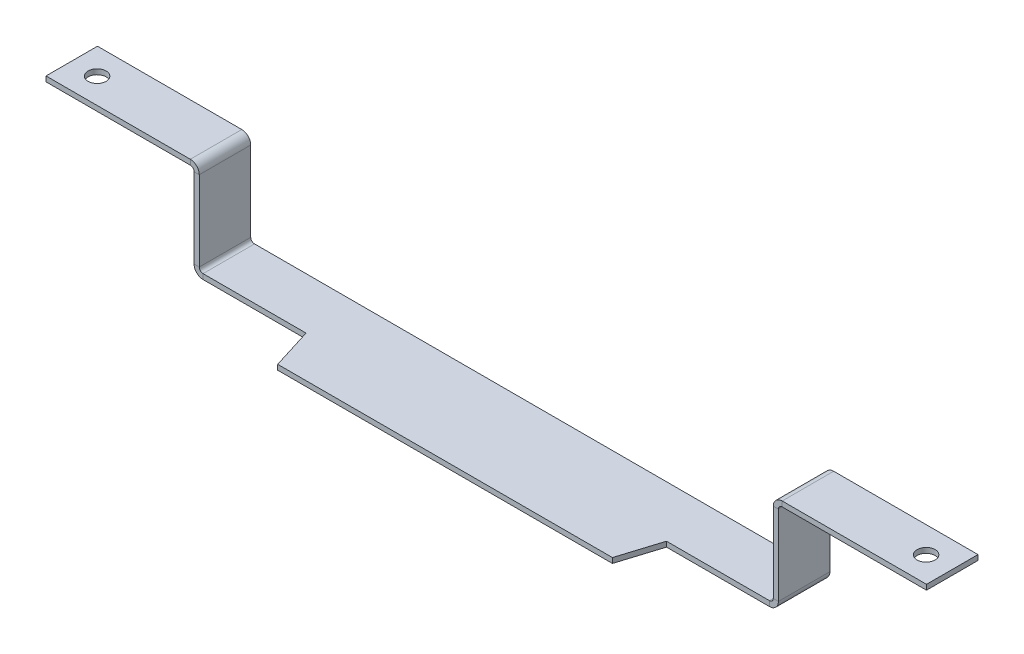
ISO-10303-21;
HEADER;
FILE_DESCRIPTION(('STEP AP214'),'2;1');
FILE_NAME('part.step','',(''),(''),'','','');
FILE_SCHEMA(('AUTOMOTIVE_DESIGN { 1 0 10303 214 1 1 1 1 }'));
ENDSEC;
DATA;
#1=APPLICATION_CONTEXT('core data for automotive mechanical design processes');
#2=APPLICATION_PROTOCOL_DEFINITION('international standard','automotive_design',2000,#1);
#3=PRODUCT_CONTEXT('',#1,'mechanical');
#4=PRODUCT('Part','Part','',(#3));
#5=PRODUCT_RELATED_PRODUCT_CATEGORY('part','',(#4));
#6=PRODUCT_DEFINITION_FORMATION('','',#4);
#7=PRODUCT_DEFINITION_CONTEXT('part definition',#1,'design');
#8=PRODUCT_DEFINITION('design','',#6,#7);
#9=PRODUCT_DEFINITION_SHAPE('','',#8);
#10=(LENGTH_UNIT() NAMED_UNIT(*) SI_UNIT(.MILLI.,.METRE.));
#11=(NAMED_UNIT(*) PLANE_ANGLE_UNIT() SI_UNIT($,.RADIAN.));
#12=(NAMED_UNIT(*) SI_UNIT($,.STERADIAN.) SOLID_ANGLE_UNIT());
#13=UNCERTAINTY_MEASURE_WITH_UNIT(LENGTH_MEASURE(1.E-05),#10,'distance_accuracy_value','');
#14=(GEOMETRIC_REPRESENTATION_CONTEXT(3) GLOBAL_UNCERTAINTY_ASSIGNED_CONTEXT((#13)) GLOBAL_UNIT_ASSIGNED_CONTEXT((#10,
#11,#12)) REPRESENTATION_CONTEXT('',''));
#15=CARTESIAN_POINT('',(0.,0.,0.));
#16=DIRECTION('',(0.,0.,1.));
#17=DIRECTION('',(1.,0.,0.));
#18=AXIS2_PLACEMENT_3D('',#15,#16,#17);
#19=CARTESIAN_POINT('',(0.,0.,0.));
#20=DIRECTION('',(0.,1.,0.));
#21=DIRECTION('',(0.,0.,1.));
#22=AXIS2_PLACEMENT_3D('',#19,#20,#21);
#23=PLANE('',#22);
#24=DIRECTION('',(1.,0.,0.));
#25=VECTOR('',#24,1.);
#26=CARTESIAN_POINT('',(0.,0.,5.));
#27=LINE('',#26,#25);
#28=CARTESIAN_POINT('',(-55.,0.,5.));
#29=VERTEX_POINT('',#28);
#30=CARTESIAN_POINT('',(-35.,0.,5.));
#31=VERTEX_POINT('',#30);
#32=EDGE_CURVE('E383',#29,#31,#27,.T.);
#33=ORIENTED_EDGE('',*,*,#32,.F.);
#34=DIRECTION('',(0.,0.,-1.));
#35=VECTOR('',#34,1.);
#36=CARTESIAN_POINT('',(-55.,0.,0.));
#37=LINE('',#36,#35);
#38=CARTESIAN_POINT('',(-55.,0.,-5.));
#39=VERTEX_POINT('',#38);
#40=EDGE_CURVE('E439',#29,#39,#37,.T.);
#41=ORIENTED_EDGE('',*,*,#40,.T.);
#42=DIRECTION('',(1.,0.,0.));
#43=VECTOR('',#42,1.);
#44=CARTESIAN_POINT('',(0.,0.,-5.));
#45=LINE('',#44,#43);
#46=CARTESIAN_POINT('',(55.,0.,-5.));
#47=VERTEX_POINT('',#46);
#48=EDGE_CURVE('E363',#39,#47,#45,.T.);
#49=ORIENTED_EDGE('',*,*,#48,.T.);
#50=DIRECTION('',(0.,0.,-1.));
#51=VECTOR('',#50,1.);
#52=CARTESIAN_POINT('',(55.,0.,0.));
#53=LINE('',#52,#51);
#54=CARTESIAN_POINT('',(55.,0.,5.));
#55=VERTEX_POINT('',#54);
#56=EDGE_CURVE('E397',#55,#47,#53,.T.);
#57=ORIENTED_EDGE('',*,*,#56,.F.);
#58=CARTESIAN_POINT('',(35.,0.,5.));
#59=VERTEX_POINT('',#58);
#60=EDGE_CURVE('E362',#59,#55,#27,.T.);
#61=ORIENTED_EDGE('',*,*,#60,.F.);
#62=DIRECTION('',(-0.298274993135952,0.,0.954479978035028));
#63=VECTOR('',#62,1.);
#64=CARTESIAN_POINT('',(33.3096085409252,0.,10.4092526690393));
#65=LINE('',#64,#63);
#66=CARTESIAN_POINT('',(32.5,0.,13.));
#67=VERTEX_POINT('',#66);
#68=EDGE_CURVE('E364',#59,#67,#65,.T.);
#69=ORIENTED_EDGE('',*,*,#68,.T.);
#70=DIRECTION('',(1.,0.,0.));
#71=VECTOR('',#70,1.);
#72=CARTESIAN_POINT('',(0.,0.,13.));
#73=LINE('',#72,#71);
#74=CARTESIAN_POINT('',(-32.5,0.,13.));
#75=VERTEX_POINT('',#74);
#76=EDGE_CURVE('E389',#75,#67,#73,.T.);
#77=ORIENTED_EDGE('',*,*,#76,.F.);
#78=DIRECTION('',(0.298274993135952,0.,0.954479978035028));
#79=VECTOR('',#78,1.);
#80=CARTESIAN_POINT('',(-33.3096085409252,0.,10.4092526690393));
#81=LINE('',#80,#79);
#82=EDGE_CURVE('E384',#31,#75,#81,.T.);
#83=ORIENTED_EDGE('',*,*,#82,.F.);
#84=EDGE_LOOP('',(#33,#41,#49,#57,#61,#69,#77,#83));
#85=FACE_BOUND('',#84,.T.);
#86=ADVANCED_FACE('F51',(#85),#23,.F.);
#87=CARTESIAN_POINT('',(0.,1.,5.));
#88=DIRECTION('',(0.,0.,-1.));
#89=DIRECTION('',(-1.,0.,0.));
#90=AXIS2_PLACEMENT_3D('',#87,#88,#89);
#91=PLANE('',#90);
#92=DIRECTION('',(1.,0.,0.));
#93=VECTOR('',#92,1.);
#94=CARTESIAN_POINT('',(0.,1.,5.));
#95=LINE('',#94,#93);
#96=CARTESIAN_POINT('',(-55.,1.,5.));
#97=VERTEX_POINT('',#96);
#98=CARTESIAN_POINT('',(-35.,1.,5.));
#99=VERTEX_POINT('',#98);
#100=EDGE_CURVE('E375',#97,#99,#95,.T.);
#101=ORIENTED_EDGE('',*,*,#100,.F.);
#102=DIRECTION('',(0.,-1.,0.));
#103=VECTOR('',#102,1.);
#104=CARTESIAN_POINT('',(-55.,1.,5.));
#105=LINE('',#104,#103);
#106=EDGE_CURVE('E442',#97,#29,#105,.T.);
#107=ORIENTED_EDGE('',*,*,#106,.T.);
#108=ORIENTED_EDGE('',*,*,#32,.T.);
#109=DIRECTION('',(0.,-1.,0.));
#110=VECTOR('',#109,1.);
#111=CARTESIAN_POINT('',(-35.,1.,5.));
#112=LINE('',#111,#110);
#113=EDGE_CURVE('E380',#99,#31,#112,.T.);
#114=ORIENTED_EDGE('',*,*,#113,.F.);
#115=EDGE_LOOP('',(#101,#107,#108,#114));
#116=FACE_BOUND('',#115,.T.);
#117=ADVANCED_FACE('F485',(#116),#91,.F.);
#118=CARTESIAN_POINT('',(55.7366000000002,-55.2058467377146,0.));
#119=DIRECTION('',(-1.,0.,0.));
#120=DIRECTION('',(0.,0.,1.));
#121=AXIS2_PLACEMENT_3D('',#118,#119,#120);
#122=PLANE('',#121);
#123=DIRECTION('',(0.,1.,0.));
#124=VECTOR('',#123,1.);
#125=CARTESIAN_POINT('',(55.7366000000002,-55.2058467377146,4.99999999999992));
#126=LINE('',#125,#124);
#127=CARTESIAN_POINT('',(55.7366,1.73659999999999,5.));
#128=VERTEX_POINT('',#127);
#129=CARTESIAN_POINT('',(55.7366,17.2634,5.00000000000002));
#130=VERTEX_POINT('',#129);
#131=EDGE_CURVE('E431',#128,#130,#126,.T.);
#132=ORIENTED_EDGE('',*,*,#131,.T.);
#133=DIRECTION('',(0.,0.,-1.));
#134=VECTOR('',#133,1.);
#135=CARTESIAN_POINT('',(55.7366,17.2634,0.));
#136=LINE('',#135,#134);
#137=CARTESIAN_POINT('',(55.7365999999999,17.2634,-4.99999999999998));
#138=VERTEX_POINT('',#137);
#139=EDGE_CURVE('E414',#130,#138,#136,.T.);
#140=ORIENTED_EDGE('',*,*,#139,.T.);
#141=DIRECTION('',(0.,1.,0.));
#142=VECTOR('',#141,1.);
#143=CARTESIAN_POINT('',(55.7366000000002,-55.2058467377146,-5.00000000000008));
#144=LINE('',#143,#142);
#145=CARTESIAN_POINT('',(55.7366,1.7366,-5.));
#146=VERTEX_POINT('',#145);
#147=EDGE_CURVE('E425',#146,#138,#144,.T.);
#148=ORIENTED_EDGE('',*,*,#147,.F.);
#149=DIRECTION('',(0.,0.,-1.));
#150=VECTOR('',#149,1.);
#151=CARTESIAN_POINT('',(55.7366,1.7366,0.));
#152=LINE('',#151,#150);
#153=EDGE_CURVE('E401',#128,#146,#152,.T.);
#154=ORIENTED_EDGE('',*,*,#153,.F.);
#155=EDGE_LOOP('',(#132,#140,#148,#154));
#156=FACE_BOUND('',#155,.T.);
#157=ADVANCED_FACE('F564',(#156),#122,.T.);
#158=CARTESIAN_POINT('',(55.7366000000002,-55.2058467377146,-5.00000000000008));
#159=DIRECTION('',(0.,0.,-1.));
#160=DIRECTION('',(0.,-1.,0.));
#161=AXIS2_PLACEMENT_3D('',#158,#159,#160);
#162=PLANE('',#161);
#163=ORIENTED_EDGE('',*,*,#147,.T.);
#164=DIRECTION('',(1.,0.,0.));
#165=VECTOR('',#164,1.);
#166=CARTESIAN_POINT('',(55.7365999999999,17.2634,-4.99999999999998));
#167=LINE('',#166,#165);
#168=CARTESIAN_POINT('',(56.7366,17.2634,-4.99999999999998));
#169=VERTEX_POINT('',#168);
#170=EDGE_CURVE('E421',#138,#169,#167,.T.);
#171=ORIENTED_EDGE('',*,*,#170,.T.);
#172=DIRECTION('',(0.,1.,0.));
#173=VECTOR('',#172,1.);
#174=CARTESIAN_POINT('',(56.7366000000002,-55.2058467377146,-5.00000000000008));
#175=LINE('',#174,#173);
#176=CARTESIAN_POINT('',(56.7366,1.7366,-5.));
#177=VERTEX_POINT('',#176);
#178=EDGE_CURVE('E405',#177,#169,#175,.T.);
#179=ORIENTED_EDGE('',*,*,#178,.F.);
#180=DIRECTION('',(1.,0.,0.));
#181=VECTOR('',#180,1.);
#182=CARTESIAN_POINT('',(55.7366,1.7366,-5.));
#183=LINE('',#182,#181);
#184=EDGE_CURVE('E404',#146,#177,#183,.T.);
#185=ORIENTED_EDGE('',*,*,#184,.F.);
#186=EDGE_LOOP('',(#163,#171,#179,#185));
#187=FACE_BOUND('',#186,.T.);
#188=ADVANCED_FACE('F659',(#187),#162,.T.);
#189=CARTESIAN_POINT('',(55.7366000000002,-55.2058467377146,4.99999999999992));
#190=DIRECTION('',(0.,0.,-1.));
#191=DIRECTION('',(0.,-1.,0.));
#192=AXIS2_PLACEMENT_3D('',#189,#190,#191);
#193=PLANE('',#192);
#194=DIRECTION('',(1.,0.,0.));
#195=VECTOR('',#194,1.);
#196=CARTESIAN_POINT('',(55.7366,17.2634,5.00000000000002));
#197=LINE('',#196,#195);
#198=CARTESIAN_POINT('',(56.7366,17.2634,5.00000000000002));
#199=VERTEX_POINT('',#198);
#200=EDGE_CURVE('E417',#130,#199,#197,.T.);
#201=ORIENTED_EDGE('',*,*,#200,.F.);
#202=ORIENTED_EDGE('',*,*,#131,.F.);
#203=DIRECTION('',(1.,0.,0.));
#204=VECTOR('',#203,1.);
#205=CARTESIAN_POINT('',(55.7366,1.7366,5.));
#206=LINE('',#205,#204);
#207=CARTESIAN_POINT('',(56.7366,1.7366,5.));
#208=VERTEX_POINT('',#207);
#209=EDGE_CURVE('E411',#128,#208,#206,.T.);
#210=ORIENTED_EDGE('',*,*,#209,.T.);
#211=DIRECTION('',(0.,1.,0.));
#212=VECTOR('',#211,1.);
#213=CARTESIAN_POINT('',(56.7366000000002,-55.2058467377146,4.99999999999992));
#214=LINE('',#213,#212);
#215=EDGE_CURVE('E428',#208,#199,#214,.T.);
#216=ORIENTED_EDGE('',*,*,#215,.T.);
#217=EDGE_LOOP('',(#201,#202,#210,#216));
#218=FACE_BOUND('',#217,.T.);
#219=ADVANCED_FACE('F661',(#218),#193,.F.);
#220=CARTESIAN_POINT('',(56.7366000000002,-55.2058467377146,0.));
#221=DIRECTION('',(-1.,0.,0.));
#222=DIRECTION('',(0.,0.,1.));
#223=AXIS2_PLACEMENT_3D('',#220,#221,#222);
#224=PLANE('',#223);
#225=DIRECTION('',(0.,0.,-1.));
#226=VECTOR('',#225,1.);
#227=CARTESIAN_POINT('',(56.7366,17.2634,0.));
#228=LINE('',#227,#226);
#229=EDGE_CURVE('E419',#199,#169,#228,.T.);
#230=ORIENTED_EDGE('',*,*,#229,.F.);
#231=ORIENTED_EDGE('',*,*,#215,.F.);
#232=DIRECTION('',(0.,0.,-1.));
#233=VECTOR('',#232,1.);
#234=CARTESIAN_POINT('',(56.7366,1.7366,0.));
#235=LINE('',#234,#233);
#236=EDGE_CURVE('E408',#208,#177,#235,.T.);
#237=ORIENTED_EDGE('',*,*,#236,.T.);
#238=ORIENTED_EDGE('',*,*,#178,.T.);
#239=EDGE_LOOP('',(#230,#231,#237,#238));
#240=FACE_BOUND('',#239,.T.);
#241=ADVANCED_FACE('F652',(#240),#224,.F.);
#242=CARTESIAN_POINT('',(33.3096085409252,1.,10.4092526690393));
#243=DIRECTION('',(0.954479978035028,0.,0.298274993135952));
#244=DIRECTION('',(0.298274993135952,0.,-0.954479978035028));
#245=AXIS2_PLACEMENT_3D('',#242,#243,#244);
#246=PLANE('',#245);
#247=ORIENTED_EDGE('',*,*,#68,.F.);
#248=DIRECTION('',(0.,-1.,0.));
#249=VECTOR('',#248,1.);
#250=CARTESIAN_POINT('',(35.,1.,5.));
#251=LINE('',#250,#249);
#252=CARTESIAN_POINT('',(35.,1.,5.));
#253=VERTEX_POINT('',#252);
#254=EDGE_CURVE('E360',#253,#59,#251,.T.);
#255=ORIENTED_EDGE('',*,*,#254,.F.);
#256=DIRECTION('',(-0.298274993135952,0.,0.954479978035028));
#257=VECTOR('',#256,1.);
#258=CARTESIAN_POINT('',(33.3096085409252,1.,10.4092526690393));
#259=LINE('',#258,#257);
#260=CARTESIAN_POINT('',(32.5,1.,13.));
#261=VERTEX_POINT('',#260);
#262=EDGE_CURVE('E394',#253,#261,#259,.T.);
#263=ORIENTED_EDGE('',*,*,#262,.T.);
#264=DIRECTION('',(0.,-1.,0.));
#265=VECTOR('',#264,1.);
#266=CARTESIAN_POINT('',(32.5,1.,13.));
#267=LINE('',#266,#265);
#268=EDGE_CURVE('E392',#261,#67,#267,.T.);
#269=ORIENTED_EDGE('',*,*,#268,.T.);
#270=EDGE_LOOP('',(#247,#255,#263,#269));
#271=FACE_BOUND('',#270,.T.);
#272=ADVANCED_FACE('F500',(#271),#246,.T.);
#273=CARTESIAN_POINT('',(0.,1.,13.));
#274=DIRECTION('',(0.,0.,-1.));
#275=DIRECTION('',(-1.,0.,0.));
#276=AXIS2_PLACEMENT_3D('',#273,#274,#275);
#277=PLANE('',#276);
#278=ORIENTED_EDGE('',*,*,#76,.T.);
#279=ORIENTED_EDGE('',*,*,#268,.F.);
#280=DIRECTION('',(1.,0.,0.));
#281=VECTOR('',#280,1.);
#282=CARTESIAN_POINT('',(0.,1.,13.));
#283=LINE('',#282,#281);
#284=CARTESIAN_POINT('',(-32.5,1.,13.));
#285=VERTEX_POINT('',#284);
#286=EDGE_CURVE('E371',#285,#261,#283,.T.);
#287=ORIENTED_EDGE('',*,*,#286,.F.);
#288=DIRECTION('',(0.,-1.,0.));
#289=VECTOR('',#288,1.);
#290=CARTESIAN_POINT('',(-32.5,1.,13.));
#291=LINE('',#290,#289);
#292=EDGE_CURVE('E386',#285,#75,#291,.T.);
#293=ORIENTED_EDGE('',*,*,#292,.T.);
#294=EDGE_LOOP('',(#278,#279,#287,#293));
#295=FACE_BOUND('',#294,.T.);
#296=ADVANCED_FACE('F496',(#295),#277,.F.);
#297=CARTESIAN_POINT('',(-33.3096085409252,1.,10.4092526690393));
#298=DIRECTION('',(0.954479978035028,0.,-0.298274993135952));
#299=DIRECTION('',(-0.298274993135952,0.,-0.954479978035028));
#300=AXIS2_PLACEMENT_3D('',#297,#298,#299);
#301=PLANE('',#300);
#302=ORIENTED_EDGE('',*,*,#82,.T.);
#303=ORIENTED_EDGE('',*,*,#292,.F.);
#304=DIRECTION('',(0.298274993135952,0.,0.954479978035028));
#305=VECTOR('',#304,1.);
#306=CARTESIAN_POINT('',(-33.3096085409252,1.,10.4092526690393));
#307=LINE('',#306,#305);
#308=EDGE_CURVE('E373',#99,#285,#307,.T.);
#309=ORIENTED_EDGE('',*,*,#308,.F.);
#310=ORIENTED_EDGE('',*,*,#113,.T.);
#311=EDGE_LOOP('',(#302,#303,#309,#310));
#312=FACE_BOUND('',#311,.T.);
#313=ADVANCED_FACE('F491',(#312),#301,.F.);
#314=CARTESIAN_POINT('',(0.,1.,0.));
#315=DIRECTION('',(0.,1.,0.));
#316=DIRECTION('',(0.,0.,1.));
#317=AXIS2_PLACEMENT_3D('',#314,#315,#316);
#318=PLANE('',#317);
#319=DIRECTION('',(0.,0.,-1.));
#320=VECTOR('',#319,1.);
#321=CARTESIAN_POINT('',(-55.,1.,0.));
#322=LINE('',#321,#320);
#323=CARTESIAN_POINT('',(-55.,1.,-5.));
#324=VERTEX_POINT('',#323);
#325=EDGE_CURVE('E424',#97,#324,#322,.T.);
#326=ORIENTED_EDGE('',*,*,#325,.F.);
#327=ORIENTED_EDGE('',*,*,#100,.T.);
#328=ORIENTED_EDGE('',*,*,#308,.T.);
#329=ORIENTED_EDGE('',*,*,#286,.T.);
#330=ORIENTED_EDGE('',*,*,#262,.F.);
#331=CARTESIAN_POINT('',(55.,1.,5.));
#332=VERTEX_POINT('',#331);
#333=EDGE_CURVE('E379',#253,#332,#95,.T.);
#334=ORIENTED_EDGE('',*,*,#333,.T.);
#335=DIRECTION('',(0.,0.,-1.));
#336=VECTOR('',#335,1.);
#337=CARTESIAN_POINT('',(55.,1.,0.));
#338=LINE('',#337,#336);
#339=CARTESIAN_POINT('',(55.,1.,-5.));
#340=VERTEX_POINT('',#339);
#341=EDGE_CURVE('E376',#332,#340,#338,.T.);
#342=ORIENTED_EDGE('',*,*,#341,.T.);
#343=DIRECTION('',(1.,0.,0.));
#344=VECTOR('',#343,1.);
#345=CARTESIAN_POINT('',(0.,1.,-5.));
#346=LINE('',#345,#344);
#347=EDGE_CURVE('E370',#324,#340,#346,.T.);
#348=ORIENTED_EDGE('',*,*,#347,.F.);
#349=EDGE_LOOP('',(#326,#327,#328,#329,#330,#334,#342,#348));
#350=FACE_BOUND('',#349,.T.);
#351=ADVANCED_FACE('F481',(#350),#318,.T.);
#352=CARTESIAN_POINT('',(0.,1.,-5.));
#353=DIRECTION('',(0.,0.,-1.));
#354=DIRECTION('',(-1.,0.,0.));
#355=AXIS2_PLACEMENT_3D('',#352,#353,#354);
#356=PLANE('',#355);
#357=DIRECTION('',(0.,-1.,0.));
#358=VECTOR('',#357,1.);
#359=CARTESIAN_POINT('',(-55.,1.,-5.));
#360=LINE('',#359,#358);
#361=EDGE_CURVE('E437',#324,#39,#360,.T.);
#362=ORIENTED_EDGE('',*,*,#361,.F.);
#363=ORIENTED_EDGE('',*,*,#347,.T.);
#364=DIRECTION('',(0.,-1.,0.));
#365=VECTOR('',#364,1.);
#366=CARTESIAN_POINT('',(55.,1.,-5.));
#367=LINE('',#366,#365);
#368=EDGE_CURVE('E367',#340,#47,#367,.T.);
#369=ORIENTED_EDGE('',*,*,#368,.T.);
#370=ORIENTED_EDGE('',*,*,#48,.F.);
#371=EDGE_LOOP('',(#362,#363,#369,#370));
#372=FACE_BOUND('',#371,.T.);
#373=ADVANCED_FACE('F516',(#372),#356,.T.);
#374=DIRECTION('',(0.,-1.,0.));
#375=VECTOR('',#374,1.);
#376=CARTESIAN_POINT('',(55.,1.,5.));
#377=LINE('',#376,#375);
#378=EDGE_CURVE('E355',#332,#55,#377,.T.);
#379=ORIENTED_EDGE('',*,*,#378,.F.);
#380=ORIENTED_EDGE('',*,*,#333,.F.);
#381=ORIENTED_EDGE('',*,*,#254,.T.);
#382=ORIENTED_EDGE('',*,*,#60,.T.);
#383=EDGE_LOOP('',(#379,#380,#381,#382));
#384=FACE_BOUND('',#383,.T.);
#385=ADVANCED_FACE('F505',(#384),#91,.F.);
#386=CARTESIAN_POINT('',(55.,1.7366,5.));
#387=DIRECTION('',(0.,0.,-1.));
#388=DIRECTION('',(-1.,0.,0.));
#389=AXIS2_PLACEMENT_3D('',#386,#387,#388);
#390=PLANE('',#389);
#391=ORIENTED_EDGE('',*,*,#378,.T.);
#392=CARTESIAN_POINT('',(55.,1.7366,5.));
#393=DIRECTION('',(0.,0.,-1.));
#394=DIRECTION('',(-1.,0.,0.));
#395=AXIS2_PLACEMENT_3D('',#392,#393,#394);
#396=CIRCLE('',#395,1.7366);
#397=EDGE_CURVE('E343',#55,#208,#396,.F.);
#398=ORIENTED_EDGE('',*,*,#397,.T.);
#399=ORIENTED_EDGE('',*,*,#209,.F.);
#400=CARTESIAN_POINT('',(55.,1.7366,5.));
#401=DIRECTION('',(0.,0.,1.));
#402=DIRECTION('',(1.,0.,0.));
#403=AXIS2_PLACEMENT_3D('',#400,#401,#402);
#404=CIRCLE('',#403,0.736599999999998);
#405=EDGE_CURVE('E348',#332,#128,#404,.T.);
#406=ORIENTED_EDGE('',*,*,#405,.F.);
#407=EDGE_LOOP('',(#391,#398,#399,#406));
#408=FACE_BOUND('',#407,.T.);
#409=ADVANCED_FACE('F646',(#408),#390,.F.);
#410=CARTESIAN_POINT('',(55.,1.7366,-5.));
#411=DIRECTION('',(0.,0.,1.));
#412=DIRECTION('',(1.,0.,0.));
#413=AXIS2_PLACEMENT_3D('',#410,#411,#412);
#414=PLANE('',#413);
#415=ORIENTED_EDGE('',*,*,#184,.T.);
#416=CARTESIAN_POINT('',(55.,1.7366,-5.));
#417=DIRECTION('',(0.,0.,-1.));
#418=DIRECTION('',(-1.,0.,0.));
#419=AXIS2_PLACEMENT_3D('',#416,#417,#418);
#420=CIRCLE('',#419,1.7366);
#421=EDGE_CURVE('E352',#177,#47,#420,.T.);
#422=ORIENTED_EDGE('',*,*,#421,.T.);
#423=ORIENTED_EDGE('',*,*,#368,.F.);
#424=CARTESIAN_POINT('',(55.,1.7366,-5.));
#425=DIRECTION('',(0.,0.,-1.));
#426=DIRECTION('',(1.,0.,0.));
#427=AXIS2_PLACEMENT_3D('',#424,#425,#426);
#428=CIRCLE('',#427,0.736599999999998);
#429=EDGE_CURVE('E351',#146,#340,#428,.T.);
#430=ORIENTED_EDGE('',*,*,#429,.F.);
#431=EDGE_LOOP('',(#415,#422,#423,#430));
#432=FACE_BOUND('',#431,.T.);
#433=ADVANCED_FACE('F512',(#432),#414,.F.);
#434=CARTESIAN_POINT('',(55.,1.7366,10.2358731590841));
#435=DIRECTION('',(0.,0.,-1.));
#436=DIRECTION('',(-1.,0.,0.));
#437=AXIS2_PLACEMENT_3D('',#434,#435,#436);
#438=CYLINDRICAL_SURFACE('',#437,0.7366);
#439=ORIENTED_EDGE('',*,*,#429,.T.);
#440=ORIENTED_EDGE('',*,*,#341,.F.);
#441=ORIENTED_EDGE('',*,*,#405,.T.);
#442=ORIENTED_EDGE('',*,*,#153,.T.);
#443=EDGE_LOOP('',(#439,#440,#441,#442));
#444=FACE_BOUND('',#443,.T.);
#445=ADVANCED_FACE('F508',(#444),#438,.F.);
#446=CARTESIAN_POINT('',(55.,1.7366,10.2358731590841));
#447=DIRECTION('',(0.,0.,-1.));
#448=DIRECTION('',(-1.,0.,0.));
#449=AXIS2_PLACEMENT_3D('',#446,#447,#448);
#450=CYLINDRICAL_SURFACE('',#449,1.7366);
#451=ORIENTED_EDGE('',*,*,#421,.F.);
#452=ORIENTED_EDGE('',*,*,#236,.F.);
#453=ORIENTED_EDGE('',*,*,#397,.F.);
#454=ORIENTED_EDGE('',*,*,#56,.T.);
#455=EDGE_LOOP('',(#451,#452,#453,#454));
#456=FACE_BOUND('',#455,.T.);
#457=ADVANCED_FACE('F637',(#456),#450,.T.);
#458=CARTESIAN_POINT('',(57.4732,17.2634,5.00000000000002));
#459=DIRECTION('',(0.,0.,1.));
#460=DIRECTION('',(0.,-1.,0.));
#461=AXIS2_PLACEMENT_3D('',#458,#459,#460);
#462=PLANE('',#461);
#463=ORIENTED_EDGE('',*,*,#200,.T.);
#464=CARTESIAN_POINT('',(57.4732,17.2634,5.00000000000002));
#465=DIRECTION('',(0.,0.,-1.));
#466=DIRECTION('',(-1.,0.,0.));
#467=AXIS2_PLACEMENT_3D('',#464,#465,#466);
#468=CIRCLE('',#467,0.7366);
#469=CARTESIAN_POINT('',(57.4732,18.,5.00000000000002));
#470=VERTEX_POINT('',#469);
#471=EDGE_CURVE('E301',#199,#470,#468,.T.);
#472=ORIENTED_EDGE('',*,*,#471,.T.);
#473=DIRECTION('',(0.,-1.,0.));
#474=VECTOR('',#473,1.);
#475=CARTESIAN_POINT('',(57.4732,19.,5.00000000000002));
#476=LINE('',#475,#474);
#477=CARTESIAN_POINT('',(57.4732,19.,5.00000000000002));
#478=VERTEX_POINT('',#477);
#479=EDGE_CURVE('E317',#478,#470,#476,.T.);
#480=ORIENTED_EDGE('',*,*,#479,.F.);
#481=CARTESIAN_POINT('',(57.4732,17.2634,5.00000000000002));
#482=DIRECTION('',(0.,0.,-1.));
#483=DIRECTION('',(0.,1.,0.));
#484=AXIS2_PLACEMENT_3D('',#481,#482,#483);
#485=CIRCLE('',#484,1.7366);
#486=EDGE_CURVE('E336',#130,#478,#485,.T.);
#487=ORIENTED_EDGE('',*,*,#486,.F.);
#488=EDGE_LOOP('',(#463,#472,#480,#487));
#489=FACE_BOUND('',#488,.T.);
#490=ADVANCED_FACE('F633',(#489),#462,.T.);
#491=CARTESIAN_POINT('',(57.4731999999999,17.2634,-4.99999999999998));
#492=DIRECTION('',(0.,0.,-1.));
#493=DIRECTION('',(0.,1.,0.));
#494=AXIS2_PLACEMENT_3D('',#491,#492,#493);
#495=PLANE('',#494);
#496=DIRECTION('',(0.,-1.,0.));
#497=VECTOR('',#496,1.);
#498=CARTESIAN_POINT('',(57.4731999999999,19.,-4.99999999999998));
#499=LINE('',#498,#497);
#500=CARTESIAN_POINT('',(57.4731999999999,19.,-4.99999999999998));
#501=VERTEX_POINT('',#500);
#502=CARTESIAN_POINT('',(57.4731999999999,18.,-4.99999999999998));
#503=VERTEX_POINT('',#502);
#504=EDGE_CURVE('E331',#501,#503,#499,.T.);
#505=ORIENTED_EDGE('',*,*,#504,.T.);
#506=CARTESIAN_POINT('',(57.4731999999999,17.2634,-4.99999999999998));
#507=DIRECTION('',(0.,0.,-1.));
#508=DIRECTION('',(-1.,0.,0.));
#509=AXIS2_PLACEMENT_3D('',#506,#507,#508);
#510=CIRCLE('',#509,0.7366);
#511=EDGE_CURVE('E340',#503,#169,#510,.F.);
#512=ORIENTED_EDGE('',*,*,#511,.T.);
#513=ORIENTED_EDGE('',*,*,#170,.F.);
#514=CARTESIAN_POINT('',(57.4731999999999,17.2634,-4.99999999999998));
#515=DIRECTION('',(0.,0.,1.));
#516=DIRECTION('',(0.,1.,0.));
#517=AXIS2_PLACEMENT_3D('',#514,#515,#516);
#518=CIRCLE('',#517,1.7366);
#519=EDGE_CURVE('E339',#501,#138,#518,.T.);
#520=ORIENTED_EDGE('',*,*,#519,.F.);
#521=EDGE_LOOP('',(#505,#512,#513,#520));
#522=FACE_BOUND('',#521,.T.);
#523=ADVANCED_FACE('F626',(#522),#495,.T.);
#524=CARTESIAN_POINT('',(57.4732,17.2634,10.2358731590841));
#525=DIRECTION('',(0.,0.,-1.));
#526=DIRECTION('',(-1.,0.,0.));
#527=AXIS2_PLACEMENT_3D('',#524,#525,#526);
#528=CYLINDRICAL_SURFACE('',#527,1.7366);
#529=ORIENTED_EDGE('',*,*,#519,.T.);
#530=ORIENTED_EDGE('',*,*,#139,.F.);
#531=ORIENTED_EDGE('',*,*,#486,.T.);
#532=DIRECTION('',(0.,0.,-1.));
#533=VECTOR('',#532,1.);
#534=CARTESIAN_POINT('',(57.4732,19.,0.));
#535=LINE('',#534,#533);
#536=EDGE_CURVE('E293',#478,#501,#535,.T.);
#537=ORIENTED_EDGE('',*,*,#536,.T.);
#538=EDGE_LOOP('',(#529,#530,#531,#537));
#539=FACE_BOUND('',#538,.T.);
#540=ADVANCED_FACE('F623',(#539),#528,.T.);
#541=CARTESIAN_POINT('',(57.4732,17.2634,10.2358731590841));
#542=DIRECTION('',(0.,0.,-1.));
#543=DIRECTION('',(-1.,0.,0.));
#544=AXIS2_PLACEMENT_3D('',#541,#542,#543);
#545=CYLINDRICAL_SURFACE('',#544,0.7366);
#546=ORIENTED_EDGE('',*,*,#511,.F.);
#547=DIRECTION('',(0.,0.,-1.));
#548=VECTOR('',#547,1.);
#549=CARTESIAN_POINT('',(57.4732,18.,0.));
#550=LINE('',#549,#548);
#551=EDGE_CURVE('E309',#470,#503,#550,.T.);
#552=ORIENTED_EDGE('',*,*,#551,.F.);
#553=ORIENTED_EDGE('',*,*,#471,.F.);
#554=ORIENTED_EDGE('',*,*,#229,.T.);
#555=EDGE_LOOP('',(#546,#552,#553,#554));
#556=FACE_BOUND('',#555,.T.);
#557=ADVANCED_FACE('F603',(#556),#545,.F.);
#558=CARTESIAN_POINT('',(80.5,19.,0.0756483860539354));
#559=DIRECTION('',(0.,-1.,0.));
#560=DIRECTION('',(0.,0.,-1.));
#561=AXIS2_PLACEMENT_3D('',#558,#559,#560);
#562=CYLINDRICAL_SURFACE('',#561,1.75);
#563=CARTESIAN_POINT('',(80.5,19.,0.0756483860539354));
#564=DIRECTION('',(0.,1.,0.));
#565=DIRECTION('',(0.,0.,1.));
#566=AXIS2_PLACEMENT_3D('',#563,#564,#565);
#567=CIRCLE('',#566,1.75);
#568=CARTESIAN_POINT('',(80.5,19.,1.82564838605393));
#569=VERTEX_POINT('',#568);
#570=EDGE_CURVE('E328',#569,#569,#567,.T.);
#571=ORIENTED_EDGE('',*,*,#570,.T.);
#572=EDGE_LOOP('',(#571));
#573=FACE_BOUND('',#572,.T.);
#574=CARTESIAN_POINT('',(80.5,18.,0.075648386053934));
#575=DIRECTION('',(0.,1.,0.));
#576=DIRECTION('',(0.,0.,1.));
#577=AXIS2_PLACEMENT_3D('',#574,#575,#576);
#578=CIRCLE('',#577,1.75);
#579=CARTESIAN_POINT('',(80.5,18.,1.82564838605393));
#580=VERTEX_POINT('',#579);
#581=EDGE_CURVE('E312',#580,#580,#578,.T.);
#582=ORIENTED_EDGE('',*,*,#581,.F.);
#583=EDGE_LOOP('',(#582));
#584=FACE_BOUND('',#583,.T.);
#585=ADVANCED_FACE('F599',(#573,#584),#562,.F.);
#586=CARTESIAN_POINT('',(85.5,19.,0.));
#587=DIRECTION('',(1.,0.,0.));
#588=DIRECTION('',(0.,0.,-1.));
#589=AXIS2_PLACEMENT_3D('',#586,#587,#588);
#590=PLANE('',#589);
#591=DIRECTION('',(0.,0.,1.));
#592=VECTOR('',#591,1.);
#593=CARTESIAN_POINT('',(85.5,18.,0.));
#594=LINE('',#593,#592);
#595=CARTESIAN_POINT('',(85.5,18.,-5.00000000000004));
#596=VERTEX_POINT('',#595);
#597=CARTESIAN_POINT('',(85.5,18.,4.99999999999996));
#598=VERTEX_POINT('',#597);
#599=EDGE_CURVE('E304',#596,#598,#594,.T.);
#600=ORIENTED_EDGE('',*,*,#599,.F.);
#601=DIRECTION('',(0.,-1.,0.));
#602=VECTOR('',#601,1.);
#603=CARTESIAN_POINT('',(85.5,19.,-5.00000000000004));
#604=LINE('',#603,#602);
#605=CARTESIAN_POINT('',(85.5,19.,-5.00000000000004));
#606=VERTEX_POINT('',#605);
#607=EDGE_CURVE('E298',#606,#596,#604,.T.);
#608=ORIENTED_EDGE('',*,*,#607,.F.);
#609=DIRECTION('',(0.,0.,1.));
#610=VECTOR('',#609,1.);
#611=CARTESIAN_POINT('',(85.5,19.,0.));
#612=LINE('',#611,#610);
#613=CARTESIAN_POINT('',(85.5,19.,4.99999999999996));
#614=VERTEX_POINT('',#613);
#615=EDGE_CURVE('E325',#606,#614,#612,.T.);
#616=ORIENTED_EDGE('',*,*,#615,.T.);
#617=DIRECTION('',(0.,-1.,0.));
#618=VECTOR('',#617,1.);
#619=CARTESIAN_POINT('',(85.5,19.,4.99999999999996));
#620=LINE('',#619,#618);
#621=EDGE_CURVE('E322',#614,#598,#620,.T.);
#622=ORIENTED_EDGE('',*,*,#621,.T.);
#623=EDGE_LOOP('',(#600,#608,#616,#622));
#624=FACE_BOUND('',#623,.T.);
#625=ADVANCED_FACE('F602',(#624),#590,.T.);
#626=CARTESIAN_POINT('',(-16.9384934754292,19.,1.25991846782511E-13));
#627=DIRECTION('',(0.,1.,0.));
#628=DIRECTION('',(0.,0.,1.));
#629=AXIS2_PLACEMENT_3D('',#626,#627,#628);
#630=PLANE('',#629);
#631=ORIENTED_EDGE('',*,*,#536,.F.);
#632=DIRECTION('',(1.,0.,0.));
#633=VECTOR('',#632,1.);
#634=CARTESIAN_POINT('',(-16.9384934754292,19.,5.00000000000013));
#635=LINE('',#634,#633);
#636=EDGE_CURVE('E320',#478,#614,#635,.T.);
#637=ORIENTED_EDGE('',*,*,#636,.T.);
#638=ORIENTED_EDGE('',*,*,#615,.F.);
#639=DIRECTION('',(1.,0.,0.));
#640=VECTOR('',#639,1.);
#641=CARTESIAN_POINT('',(-16.9384934754292,19.,-4.99999999999987));
#642=LINE('',#641,#640);
#643=EDGE_CURVE('E302',#501,#606,#642,.T.);
#644=ORIENTED_EDGE('',*,*,#643,.F.);
#645=EDGE_LOOP('',(#631,#637,#638,#644));
#646=FACE_BOUND('',#645,.T.);
#647=ORIENTED_EDGE('',*,*,#570,.F.);
#648=EDGE_LOOP('',(#647));
#649=FACE_BOUND('',#648,.T.);
#650=ADVANCED_FACE('F607',(#646,#649),#630,.T.);
#651=CARTESIAN_POINT('',(-16.9384934754292,19.,5.00000000000013));
#652=DIRECTION('',(0.,0.,-1.));
#653=DIRECTION('',(-1.,0.,0.));
#654=AXIS2_PLACEMENT_3D('',#651,#652,#653);
#655=PLANE('',#654);
#656=ORIENTED_EDGE('',*,*,#636,.F.);
#657=ORIENTED_EDGE('',*,*,#479,.T.);
#658=DIRECTION('',(1.,0.,0.));
#659=VECTOR('',#658,1.);
#660=CARTESIAN_POINT('',(-16.9384934754292,18.,5.00000000000013));
#661=LINE('',#660,#659);
#662=EDGE_CURVE('E315',#470,#598,#661,.T.);
#663=ORIENTED_EDGE('',*,*,#662,.T.);
#664=ORIENTED_EDGE('',*,*,#621,.F.);
#665=EDGE_LOOP('',(#656,#657,#663,#664));
#666=FACE_BOUND('',#665,.T.);
#667=ADVANCED_FACE('F611',(#666),#655,.F.);
#668=CARTESIAN_POINT('',(-16.9384934754292,18.,1.2460406800173E-13));
#669=DIRECTION('',(0.,1.,0.));
#670=DIRECTION('',(0.,0.,1.));
#671=AXIS2_PLACEMENT_3D('',#668,#669,#670);
#672=PLANE('',#671);
#673=ORIENTED_EDGE('',*,*,#581,.T.);
#674=EDGE_LOOP('',(#673));
#675=FACE_BOUND('',#674,.T.);
#676=ORIENTED_EDGE('',*,*,#662,.F.);
#677=ORIENTED_EDGE('',*,*,#551,.T.);
#678=DIRECTION('',(1.,0.,0.));
#679=VECTOR('',#678,1.);
#680=CARTESIAN_POINT('',(-16.9384934754292,18.,-4.99999999999987));
#681=LINE('',#680,#679);
#682=EDGE_CURVE('E307',#503,#596,#681,.T.);
#683=ORIENTED_EDGE('',*,*,#682,.T.);
#684=ORIENTED_EDGE('',*,*,#599,.T.);
#685=EDGE_LOOP('',(#676,#677,#683,#684));
#686=FACE_BOUND('',#685,.T.);
#687=ADVANCED_FACE('F615',(#675,#686),#672,.F.);
#688=CARTESIAN_POINT('',(-16.9384934754292,19.,-4.99999999999987));
#689=DIRECTION('',(0.,0.,-1.));
#690=DIRECTION('',(-1.,0.,0.));
#691=AXIS2_PLACEMENT_3D('',#688,#689,#690);
#692=PLANE('',#691);
#693=ORIENTED_EDGE('',*,*,#504,.F.);
#694=ORIENTED_EDGE('',*,*,#643,.T.);
#695=ORIENTED_EDGE('',*,*,#607,.T.);
#696=ORIENTED_EDGE('',*,*,#682,.F.);
#697=EDGE_LOOP('',(#693,#694,#695,#696));
#698=FACE_BOUND('',#697,.T.);
#699=ADVANCED_FACE('F596',(#698),#692,.T.);
#700=CARTESIAN_POINT('',(-55.,1.7366,5.));
#701=DIRECTION('',(0.,0.,-1.));
#702=DIRECTION('',(-1.,0.,0.));
#703=AXIS2_PLACEMENT_3D('',#700,#701,#702);
#704=PLANE('',#703);
#705=DIRECTION('',(-1.,0.,0.));
#706=VECTOR('',#705,1.);
#707=CARTESIAN_POINT('',(-55.7366,1.7366,5.));
#708=LINE('',#707,#706);
#709=CARTESIAN_POINT('',(-55.7366,1.7366,5.));
#710=VERTEX_POINT('',#709);
#711=CARTESIAN_POINT('',(-56.7366,1.73660000000001,5.));
#712=VERTEX_POINT('',#711);
#713=EDGE_CURVE('E270',#710,#712,#708,.T.);
#714=ORIENTED_EDGE('',*,*,#713,.T.);
#715=CARTESIAN_POINT('',(-55.,1.7366,5.));
#716=DIRECTION('',(0.,0.,1.));
#717=DIRECTION('',(1.,0.,0.));
#718=AXIS2_PLACEMENT_3D('',#715,#716,#717);
#719=CIRCLE('',#718,1.7366);
#720=EDGE_CURVE('E76',#712,#29,#719,.T.);
#721=ORIENTED_EDGE('',*,*,#720,.T.);
#722=ORIENTED_EDGE('',*,*,#106,.F.);
#723=CARTESIAN_POINT('',(-55.,1.7366,5.));
#724=DIRECTION('',(0.,0.,1.));
#725=DIRECTION('',(1.,0.,0.));
#726=AXIS2_PLACEMENT_3D('',#723,#724,#725);
#727=CIRCLE('',#726,0.736599999999998);
#728=EDGE_CURVE('E286',#710,#97,#727,.T.);
#729=ORIENTED_EDGE('',*,*,#728,.F.);
#730=EDGE_LOOP('',(#714,#721,#722,#729));
#731=FACE_BOUND('',#730,.T.);
#732=ADVANCED_FACE('F523',(#731),#704,.F.);
#733=CARTESIAN_POINT('',(-55.,1.7366,-5.));
#734=DIRECTION('',(0.,0.,1.));
#735=DIRECTION('',(1.,0.,0.));
#736=AXIS2_PLACEMENT_3D('',#733,#734,#735);
#737=PLANE('',#736);
#738=CARTESIAN_POINT('',(-55.,1.7366,-5.));
#739=DIRECTION('',(0.,0.,1.));
#740=DIRECTION('',(1.,0.,0.));
#741=AXIS2_PLACEMENT_3D('',#738,#739,#740);
#742=CIRCLE('',#741,1.7366);
#743=CARTESIAN_POINT('',(-56.7366,1.73660000000001,-5.));
#744=VERTEX_POINT('',#743);
#745=EDGE_CURVE('E290',#39,#744,#742,.F.);
#746=ORIENTED_EDGE('',*,*,#745,.T.);
#747=DIRECTION('',(-1.,0.,0.));
#748=VECTOR('',#747,1.);
#749=CARTESIAN_POINT('',(-55.7366,1.7366,-5.));
#750=LINE('',#749,#748);
#751=CARTESIAN_POINT('',(-55.7366,1.7366,-5.));
#752=VERTEX_POINT('',#751);
#753=EDGE_CURVE('E274',#752,#744,#750,.T.);
#754=ORIENTED_EDGE('',*,*,#753,.F.);
#755=CARTESIAN_POINT('',(-55.,1.7366,-5.));
#756=DIRECTION('',(0.,0.,-1.));
#757=DIRECTION('',(1.,0.,0.));
#758=AXIS2_PLACEMENT_3D('',#755,#756,#757);
#759=CIRCLE('',#758,0.736599999999998);
#760=EDGE_CURVE('E289',#324,#752,#759,.T.);
#761=ORIENTED_EDGE('',*,*,#760,.F.);
#762=ORIENTED_EDGE('',*,*,#361,.T.);
#763=EDGE_LOOP('',(#746,#754,#761,#762));
#764=FACE_BOUND('',#763,.T.);
#765=ADVANCED_FACE('F474',(#764),#737,.F.);
#766=CARTESIAN_POINT('',(-55.,1.7366,-10.2358731590841));
#767=DIRECTION('',(0.,0.,1.));
#768=DIRECTION('',(1.,0.,0.));
#769=AXIS2_PLACEMENT_3D('',#766,#767,#768);
#770=CYLINDRICAL_SURFACE('',#769,0.7366);
#771=ORIENTED_EDGE('',*,*,#325,.T.);
#772=ORIENTED_EDGE('',*,*,#760,.T.);
#773=DIRECTION('',(0.,0.,-1.));
#774=VECTOR('',#773,1.);
#775=CARTESIAN_POINT('',(-55.7366,1.7366,0.));
#776=LINE('',#775,#774);
#777=EDGE_CURVE('E279',#710,#752,#776,.T.);
#778=ORIENTED_EDGE('',*,*,#777,.F.);
#779=ORIENTED_EDGE('',*,*,#728,.T.);
#780=EDGE_LOOP('',(#771,#772,#778,#779));
#781=FACE_BOUND('',#780,.T.);
#782=ADVANCED_FACE('F477',(#781),#770,.F.);
#783=CARTESIAN_POINT('',(-55.,1.7366,-10.2358731590841));
#784=DIRECTION('',(0.,0.,1.));
#785=DIRECTION('',(1.,0.,0.));
#786=AXIS2_PLACEMENT_3D('',#783,#784,#785);
#787=CYLINDRICAL_SURFACE('',#786,1.7366);
#788=ORIENTED_EDGE('',*,*,#40,.F.);
#789=ORIENTED_EDGE('',*,*,#720,.F.);
#790=DIRECTION('',(0.,0.,-1.));
#791=VECTOR('',#790,1.);
#792=CARTESIAN_POINT('',(-56.7366,1.73660000000001,0.));
#793=LINE('',#792,#791);
#794=EDGE_CURVE('E282',#712,#744,#793,.T.);
#795=ORIENTED_EDGE('',*,*,#794,.T.);
#796=ORIENTED_EDGE('',*,*,#745,.F.);
#797=EDGE_LOOP('',(#788,#789,#795,#796));
#798=FACE_BOUND('',#797,.T.);
#799=ADVANCED_FACE('F518',(#798),#787,.T.);
#800=CARTESIAN_POINT('',(-55.7366000000002,-55.2058467377146,0.));
#801=DIRECTION('',(1.,0.,0.));
#802=DIRECTION('',(0.,0.,1.));
#803=AXIS2_PLACEMENT_3D('',#800,#801,#802);
#804=PLANE('',#803);
#805=DIRECTION('',(0.,0.,-1.));
#806=VECTOR('',#805,1.);
#807=CARTESIAN_POINT('',(-55.7365999999999,17.2634,0.));
#808=LINE('',#807,#806);
#809=CARTESIAN_POINT('',(-55.7365999999999,17.2634,5.));
#810=VERTEX_POINT('',#809);
#811=CARTESIAN_POINT('',(-55.7365999999999,17.2634,-5.));
#812=VERTEX_POINT('',#811);
#813=EDGE_CURVE('E445',#810,#812,#808,.T.);
#814=ORIENTED_EDGE('',*,*,#813,.F.);
#815=DIRECTION('',(0.,-1.,0.));
#816=VECTOR('',#815,1.);
#817=CARTESIAN_POINT('',(-55.7366000000002,-55.2058467377146,5.));
#818=LINE('',#817,#816);
#819=EDGE_CURVE('E55',#810,#710,#818,.T.);
#820=ORIENTED_EDGE('',*,*,#819,.T.);
#821=ORIENTED_EDGE('',*,*,#777,.T.);
#822=DIRECTION('',(0.,-1.,0.));
#823=VECTOR('',#822,1.);
#824=CARTESIAN_POINT('',(-55.7366000000002,-55.2058467377146,-5.));
#825=LINE('',#824,#823);
#826=EDGE_CURVE('E278',#812,#752,#825,.T.);
#827=ORIENTED_EDGE('',*,*,#826,.F.);
#828=EDGE_LOOP('',(#814,#820,#821,#827));
#829=FACE_BOUND('',#828,.T.);
#830=ADVANCED_FACE('F468',(#829),#804,.T.);
#831=CARTESIAN_POINT('',(-55.7366000000002,-55.2058467377146,-5.));
#832=DIRECTION('',(0.,0.,-1.));
#833=DIRECTION('',(0.,1.,0.));
#834=AXIS2_PLACEMENT_3D('',#831,#832,#833);
#835=PLANE('',#834);
#836=DIRECTION('',(-1.,0.,0.));
#837=VECTOR('',#836,1.);
#838=CARTESIAN_POINT('',(-55.7365999999999,17.2634,-5.));
#839=LINE('',#838,#837);
#840=CARTESIAN_POINT('',(-56.7366,17.2634,-5.));
#841=VERTEX_POINT('',#840);
#842=EDGE_CURVE('E453',#812,#841,#839,.T.);
#843=ORIENTED_EDGE('',*,*,#842,.F.);
#844=ORIENTED_EDGE('',*,*,#826,.T.);
#845=ORIENTED_EDGE('',*,*,#753,.T.);
#846=DIRECTION('',(0.,-1.,0.));
#847=VECTOR('',#846,1.);
#848=CARTESIAN_POINT('',(-56.7366000000002,-55.2058467377146,-5.));
#849=LINE('',#848,#847);
#850=EDGE_CURVE('E277',#841,#744,#849,.T.);
#851=ORIENTED_EDGE('',*,*,#850,.F.);
#852=EDGE_LOOP('',(#843,#844,#845,#851));
#853=FACE_BOUND('',#852,.T.);
#854=ADVANCED_FACE('F461',(#853),#835,.T.);
#855=CARTESIAN_POINT('',(-56.7366000000002,-55.2058467377146,0.));
#856=DIRECTION('',(1.,0.,0.));
#857=DIRECTION('',(0.,0.,1.));
#858=AXIS2_PLACEMENT_3D('',#855,#856,#857);
#859=PLANE('',#858);
#860=DIRECTION('',(0.,-1.,0.));
#861=VECTOR('',#860,1.);
#862=CARTESIAN_POINT('',(-56.7366000000002,-55.2058467377146,5.));
#863=LINE('',#862,#861);
#864=CARTESIAN_POINT('',(-56.7366,17.2634,5.));
#865=VERTEX_POINT('',#864);
#866=EDGE_CURVE('E295',#865,#712,#863,.T.);
#867=ORIENTED_EDGE('',*,*,#866,.F.);
#868=DIRECTION('',(0.,0.,-1.));
#869=VECTOR('',#868,1.);
#870=CARTESIAN_POINT('',(-56.7366,17.2634,0.));
#871=LINE('',#870,#869);
#872=EDGE_CURVE('E60',#865,#841,#871,.T.);
#873=ORIENTED_EDGE('',*,*,#872,.T.);
#874=ORIENTED_EDGE('',*,*,#850,.T.);
#875=ORIENTED_EDGE('',*,*,#794,.F.);
#876=EDGE_LOOP('',(#867,#873,#874,#875));
#877=FACE_BOUND('',#876,.T.);
#878=ADVANCED_FACE('F522',(#877),#859,.F.);
#879=CARTESIAN_POINT('',(-55.7366000000002,-55.2058467377146,5.));
#880=DIRECTION('',(0.,0.,-1.));
#881=DIRECTION('',(0.,1.,0.));
#882=AXIS2_PLACEMENT_3D('',#879,#880,#881);
#883=PLANE('',#882);
#884=ORIENTED_EDGE('',*,*,#819,.F.);
#885=DIRECTION('',(-1.,0.,0.));
#886=VECTOR('',#885,1.);
#887=CARTESIAN_POINT('',(-55.7365999999999,17.2634,5.));
#888=LINE('',#887,#886);
#889=EDGE_CURVE('E12',#810,#865,#888,.T.);
#890=ORIENTED_EDGE('',*,*,#889,.T.);
#891=ORIENTED_EDGE('',*,*,#866,.T.);
#892=ORIENTED_EDGE('',*,*,#713,.F.);
#893=EDGE_LOOP('',(#884,#890,#891,#892));
#894=FACE_BOUND('',#893,.T.);
#895=ADVANCED_FACE('F53',(#894),#883,.F.);
#896=CARTESIAN_POINT('',(-57.4731999999999,17.2634,5.));
#897=DIRECTION('',(0.,0.,1.));
#898=DIRECTION('',(1.,0.,0.));
#899=AXIS2_PLACEMENT_3D('',#896,#897,#898);
#900=PLANE('',#899);
#901=DIRECTION('',(0.,-1.,0.));
#902=VECTOR('',#901,1.);
#903=CARTESIAN_POINT('',(-57.4731999999999,19.,5.));
#904=LINE('',#903,#902);
#905=CARTESIAN_POINT('',(-57.4731999999999,19.,5.));
#906=VERTEX_POINT('',#905);
#907=CARTESIAN_POINT('',(-57.4731999999999,18.,5.));
#908=VERTEX_POINT('',#907);
#909=EDGE_CURVE('E221',#906,#908,#904,.T.);
#910=ORIENTED_EDGE('',*,*,#909,.T.);
#911=CARTESIAN_POINT('',(-57.4731999999999,17.2634,5.));
#912=DIRECTION('',(0.,0.,1.));
#913=DIRECTION('',(1.,0.,0.));
#914=AXIS2_PLACEMENT_3D('',#911,#912,#913);
#915=CIRCLE('',#914,0.7366);
#916=EDGE_CURVE('E68',#908,#865,#915,.F.);
#917=ORIENTED_EDGE('',*,*,#916,.T.);
#918=ORIENTED_EDGE('',*,*,#889,.F.);
#919=CARTESIAN_POINT('',(-57.4731999999999,17.2634,5.));
#920=DIRECTION('',(0.,0.,-1.));
#921=DIRECTION('',(-1.,0.,0.));
#922=AXIS2_PLACEMENT_3D('',#919,#920,#921);
#923=CIRCLE('',#922,1.7366);
#924=EDGE_CURVE('E263',#906,#810,#923,.T.);
#925=ORIENTED_EDGE('',*,*,#924,.F.);
#926=EDGE_LOOP('',(#910,#917,#918,#925));
#927=FACE_BOUND('',#926,.T.);
#928=ADVANCED_FACE('F526',(#927),#900,.T.);
#929=CARTESIAN_POINT('',(-57.4731999999999,17.2634,-5.));
#930=DIRECTION('',(0.,0.,-1.));
#931=DIRECTION('',(-1.,0.,0.));
#932=AXIS2_PLACEMENT_3D('',#929,#930,#931);
#933=PLANE('',#932);
#934=CARTESIAN_POINT('',(-57.4731999999999,17.2634,-5.));
#935=DIRECTION('',(0.,0.,1.));
#936=DIRECTION('',(1.,0.,0.));
#937=AXIS2_PLACEMENT_3D('',#934,#935,#936);
#938=CIRCLE('',#937,0.7366);
#939=CARTESIAN_POINT('',(-57.4731999999999,18.,-5.));
#940=VERTEX_POINT('',#939);
#941=EDGE_CURVE('E267',#841,#940,#938,.T.);
#942=ORIENTED_EDGE('',*,*,#941,.T.);
#943=DIRECTION('',(0.,-1.,0.));
#944=VECTOR('',#943,1.);
#945=CARTESIAN_POINT('',(-57.4731999999999,19.,-5.));
#946=LINE('',#945,#944);
#947=CARTESIAN_POINT('',(-57.4731999999999,19.,-5.));
#948=VERTEX_POINT('',#947);
#949=EDGE_CURVE('E244',#948,#940,#946,.T.);
#950=ORIENTED_EDGE('',*,*,#949,.F.);
#951=CARTESIAN_POINT('',(-57.4731999999999,17.2634,-5.));
#952=DIRECTION('',(0.,0.,1.));
#953=DIRECTION('',(-1.,0.,0.));
#954=AXIS2_PLACEMENT_3D('',#951,#952,#953);
#955=CIRCLE('',#954,1.7366);
#956=EDGE_CURVE('E266',#812,#948,#955,.T.);
#957=ORIENTED_EDGE('',*,*,#956,.F.);
#958=ORIENTED_EDGE('',*,*,#842,.T.);
#959=EDGE_LOOP('',(#942,#950,#957,#958));
#960=FACE_BOUND('',#959,.T.);
#961=ADVANCED_FACE('F534',(#960),#933,.T.);
#962=CARTESIAN_POINT('',(-57.4731999999999,17.2634,-10.2358731590841));
#963=DIRECTION('',(0.,0.,1.));
#964=DIRECTION('',(1.,0.,0.));
#965=AXIS2_PLACEMENT_3D('',#962,#963,#964);
#966=CYLINDRICAL_SURFACE('',#965,1.7366);
#967=ORIENTED_EDGE('',*,*,#813,.T.);
#968=ORIENTED_EDGE('',*,*,#956,.T.);
#969=DIRECTION('',(0.,0.,-1.));
#970=VECTOR('',#969,1.);
#971=CARTESIAN_POINT('',(-57.4731999999999,19.,0.));
#972=LINE('',#971,#970);
#973=EDGE_CURVE('E224',#906,#948,#972,.T.);
#974=ORIENTED_EDGE('',*,*,#973,.F.);
#975=ORIENTED_EDGE('',*,*,#924,.T.);
#976=EDGE_LOOP('',(#967,#968,#974,#975));
#977=FACE_BOUND('',#976,.T.);
#978=ADVANCED_FACE('F528',(#977),#966,.T.);
#979=CARTESIAN_POINT('',(-57.4731999999999,17.2634,-10.2358731590841));
#980=DIRECTION('',(0.,0.,1.));
#981=DIRECTION('',(1.,0.,0.));
#982=AXIS2_PLACEMENT_3D('',#979,#980,#981);
#983=CYLINDRICAL_SURFACE('',#982,0.7366);
#984=ORIENTED_EDGE('',*,*,#872,.F.);
#985=ORIENTED_EDGE('',*,*,#916,.F.);
#986=DIRECTION('',(0.,0.,-1.));
#987=VECTOR('',#986,1.);
#988=CARTESIAN_POINT('',(-57.4731999999999,18.,0.));
#989=LINE('',#988,#987);
#990=EDGE_CURVE('E259',#908,#940,#989,.T.);
#991=ORIENTED_EDGE('',*,*,#990,.T.);
#992=ORIENTED_EDGE('',*,*,#941,.F.);
#993=EDGE_LOOP('',(#984,#985,#991,#992));
#994=FACE_BOUND('',#993,.T.);
#995=ADVANCED_FACE('F537',(#994),#983,.F.);
#996=CARTESIAN_POINT('',(-85.5,19.,0.));
#997=DIRECTION('',(1.,0.,0.));
#998=DIRECTION('',(0.,0.,-1.));
#999=AXIS2_PLACEMENT_3D('',#996,#997,#998);
#1000=PLANE('',#999);
#1001=DIRECTION('',(0.,0.,1.));
#1002=VECTOR('',#1001,1.);
#1003=CARTESIAN_POINT('',(-85.5,18.,0.));
#1004=LINE('',#1003,#1002);
#1005=CARTESIAN_POINT('',(-85.5,18.,-5.));
#1006=VERTEX_POINT('',#1005);
#1007=CARTESIAN_POINT('',(-85.5,18.,5.));
#1008=VERTEX_POINT('',#1007);
#1009=EDGE_CURVE('E239',#1006,#1008,#1004,.T.);
#1010=ORIENTED_EDGE('',*,*,#1009,.T.);
#1011=DIRECTION('',(0.,-1.,0.));
#1012=VECTOR('',#1011,1.);
#1013=CARTESIAN_POINT('',(-85.5,19.,5.));
#1014=LINE('',#1013,#1012);
#1015=CARTESIAN_POINT('',(-85.5,19.,5.));
#1016=VERTEX_POINT('',#1015);
#1017=EDGE_CURVE('E220',#1016,#1008,#1014,.T.);
#1018=ORIENTED_EDGE('',*,*,#1017,.F.);
#1019=DIRECTION('',(0.,0.,1.));
#1020=VECTOR('',#1019,1.);
#1021=CARTESIAN_POINT('',(-85.5,19.,0.));
#1022=LINE('',#1021,#1020);
#1023=CARTESIAN_POINT('',(-85.5,19.,-5.));
#1024=VERTEX_POINT('',#1023);
#1025=EDGE_CURVE('E228',#1024,#1016,#1022,.T.);
#1026=ORIENTED_EDGE('',*,*,#1025,.F.);
#1027=DIRECTION('',(0.,-1.,0.));
#1028=VECTOR('',#1027,1.);
#1029=CARTESIAN_POINT('',(-85.5,19.,-5.));
#1030=LINE('',#1029,#1028);
#1031=EDGE_CURVE('E256',#1024,#1006,#1030,.T.);
#1032=ORIENTED_EDGE('',*,*,#1031,.T.);
#1033=EDGE_LOOP('',(#1010,#1018,#1026,#1032));
#1034=FACE_BOUND('',#1033,.T.);
#1035=ADVANCED_FACE('F237',(#1034),#1000,.F.);
#1036=CARTESIAN_POINT('',(-80.5,19.,0.0756483860539681));
#1037=DIRECTION('',(0.,-1.,0.));
#1038=DIRECTION('',(0.,0.,-1.));
#1039=AXIS2_PLACEMENT_3D('',#1036,#1037,#1038);
#1040=CYLINDRICAL_SURFACE('',#1039,1.75);
#1041=CARTESIAN_POINT('',(-80.5,19.,0.0756483860539681));
#1042=DIRECTION('',(0.,1.,0.));
#1043=DIRECTION('',(0.,0.,1.));
#1044=AXIS2_PLACEMENT_3D('',#1041,#1042,#1043);
#1045=CIRCLE('',#1044,1.75);
#1046=CARTESIAN_POINT('',(-80.5,19.,1.82564838605396));
#1047=VERTEX_POINT('',#1046);
#1048=EDGE_CURVE('E225',#1047,#1047,#1045,.F.);
#1049=ORIENTED_EDGE('',*,*,#1048,.F.);
#1050=EDGE_LOOP('',(#1049));
#1051=FACE_BOUND('',#1050,.T.);
#1052=CARTESIAN_POINT('',(-80.5,18.,0.0756483860539681));
#1053=DIRECTION('',(0.,1.,0.));
#1054=DIRECTION('',(0.,0.,1.));
#1055=AXIS2_PLACEMENT_3D('',#1052,#1053,#1054);
#1056=CIRCLE('',#1055,1.75);
#1057=CARTESIAN_POINT('',(-80.5,18.,1.82564838605396));
#1058=VERTEX_POINT('',#1057);
#1059=EDGE_CURVE('E253',#1058,#1058,#1056,.F.);
#1060=ORIENTED_EDGE('',*,*,#1059,.T.);
#1061=EDGE_LOOP('',(#1060));
#1062=FACE_BOUND('',#1061,.T.);
#1063=ADVANCED_FACE('F546',(#1051,#1062),#1040,.F.);
#1064=CARTESIAN_POINT('',(16.9384934754292,19.,0.));
#1065=DIRECTION('',(0.,1.,0.));
#1066=DIRECTION('',(0.,0.,1.));
#1067=AXIS2_PLACEMENT_3D('',#1064,#1065,#1066);
#1068=PLANE('',#1067);
#1069=ORIENTED_EDGE('',*,*,#1048,.T.);
#1070=EDGE_LOOP('',(#1069));
#1071=FACE_BOUND('',#1070,.T.);
#1072=DIRECTION('',(1.,0.,0.));
#1073=VECTOR('',#1072,1.);
#1074=CARTESIAN_POINT('',(16.9384934754292,19.,5.));
#1075=LINE('',#1074,#1073);
#1076=EDGE_CURVE('E216',#1016,#906,#1075,.T.);
#1077=ORIENTED_EDGE('',*,*,#1076,.T.);
#1078=ORIENTED_EDGE('',*,*,#973,.T.);
#1079=DIRECTION('',(1.,0.,0.));
#1080=VECTOR('',#1079,1.);
#1081=CARTESIAN_POINT('',(16.9384934754292,19.,-5.));
#1082=LINE('',#1081,#1080);
#1083=EDGE_CURVE('E231',#1024,#948,#1082,.T.);
#1084=ORIENTED_EDGE('',*,*,#1083,.F.);
#1085=ORIENTED_EDGE('',*,*,#1025,.T.);
#1086=EDGE_LOOP('',(#1077,#1078,#1084,#1085));
#1087=FACE_BOUND('',#1086,.T.);
#1088=ADVANCED_FACE('F229',(#1071,#1087),#1068,.T.);
#1089=CARTESIAN_POINT('',(16.9384934754292,19.,-5.));
#1090=DIRECTION('',(0.,0.,-1.));
#1091=DIRECTION('',(-1.,0.,0.));
#1092=AXIS2_PLACEMENT_3D('',#1089,#1090,#1091);
#1093=PLANE('',#1092);
#1094=ORIENTED_EDGE('',*,*,#1083,.T.);
#1095=ORIENTED_EDGE('',*,*,#949,.T.);
#1096=DIRECTION('',(1.,0.,0.));
#1097=VECTOR('',#1096,1.);
#1098=CARTESIAN_POINT('',(16.9384934754292,18.,-5.));
#1099=LINE('',#1098,#1097);
#1100=EDGE_CURVE('E241',#1006,#940,#1099,.T.);
#1101=ORIENTED_EDGE('',*,*,#1100,.F.);
#1102=ORIENTED_EDGE('',*,*,#1031,.F.);
#1103=EDGE_LOOP('',(#1094,#1095,#1101,#1102));
#1104=FACE_BOUND('',#1103,.T.);
#1105=ADVANCED_FACE('F532',(#1104),#1093,.T.);
#1106=CARTESIAN_POINT('',(16.9384934754292,18.,0.));
#1107=DIRECTION('',(0.,1.,0.));
#1108=DIRECTION('',(0.,0.,1.));
#1109=AXIS2_PLACEMENT_3D('',#1106,#1107,#1108);
#1110=PLANE('',#1109);
#1111=ORIENTED_EDGE('',*,*,#990,.F.);
#1112=DIRECTION('',(1.,0.,0.));
#1113=VECTOR('',#1112,1.);
#1114=CARTESIAN_POINT('',(16.9384934754292,18.,5.));
#1115=LINE('',#1114,#1113);
#1116=EDGE_CURVE('E240',#1008,#908,#1115,.T.);
#1117=ORIENTED_EDGE('',*,*,#1116,.F.);
#1118=ORIENTED_EDGE('',*,*,#1009,.F.);
#1119=ORIENTED_EDGE('',*,*,#1100,.T.);
#1120=EDGE_LOOP('',(#1111,#1117,#1118,#1119));
#1121=FACE_BOUND('',#1120,.T.);
#1122=ORIENTED_EDGE('',*,*,#1059,.F.);
#1123=EDGE_LOOP('',(#1122));
#1124=FACE_BOUND('',#1123,.T.);
#1125=ADVANCED_FACE('F540',(#1121,#1124),#1110,.F.);
#1126=CARTESIAN_POINT('',(16.9384934754292,19.,5.));
#1127=DIRECTION('',(0.,0.,-1.));
#1128=DIRECTION('',(-1.,0.,0.));
#1129=AXIS2_PLACEMENT_3D('',#1126,#1127,#1128);
#1130=PLANE('',#1129);
#1131=ORIENTED_EDGE('',*,*,#909,.F.);
#1132=ORIENTED_EDGE('',*,*,#1076,.F.);
#1133=ORIENTED_EDGE('',*,*,#1017,.T.);
#1134=ORIENTED_EDGE('',*,*,#1116,.T.);
#1135=EDGE_LOOP('',(#1131,#1132,#1133,#1134));
#1136=FACE_BOUND('',#1135,.T.);
#1137=ADVANCED_FACE('F218',(#1136),#1130,.F.);
#1138=CLOSED_SHELL('',(#86,#117,#157,#188,#219,#241,#272,#296,#313,#351,#373,#385,#409,#433,
#445,#457,#490,#523,#540,#557,#585,#625,#650,#667,#687,#699,#732,#765,#782,#799,#830,#854,#878,
#895,#928,#961,#978,#995,#1035,#1063,#1088,#1105,#1125,#1137));
#1139=MANIFOLD_SOLID_BREP('B2',#1138);
#1140=ADVANCED_BREP_SHAPE_REPRESENTATION('',(#18,#1139),#14);
#1141=SHAPE_DEFINITION_REPRESENTATION(#9,#1140);
ENDSEC;
END-ISO-10303-21;
